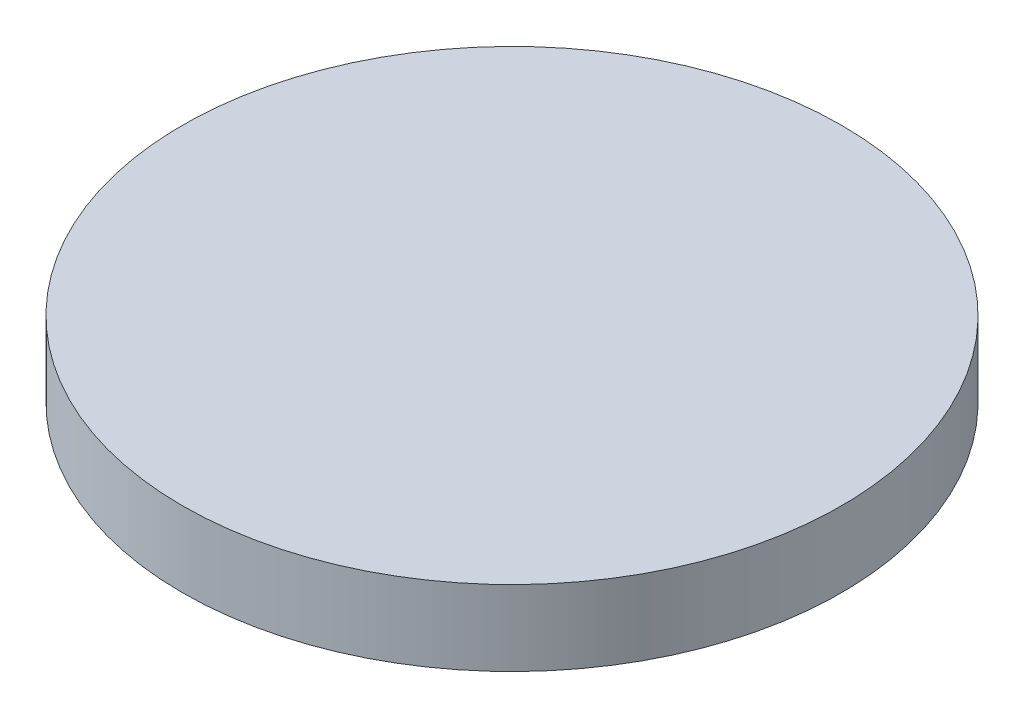
ISO-10303-21;
HEADER;
FILE_DESCRIPTION(('STEP AP214'),'2;1');
FILE_NAME('part.step','',(''),(''),'','','');
FILE_SCHEMA(('AUTOMOTIVE_DESIGN { 1 0 10303 214 1 1 1 1 }'));
ENDSEC;
DATA;
#1=APPLICATION_CONTEXT('core data for automotive mechanical design processes');
#2=APPLICATION_PROTOCOL_DEFINITION('international standard','automotive_design',2000,#1);
#3=PRODUCT_CONTEXT('',#1,'mechanical');
#4=PRODUCT('Part','Part','',(#3));
#5=PRODUCT_RELATED_PRODUCT_CATEGORY('part','',(#4));
#6=PRODUCT_DEFINITION_FORMATION('','',#4);
#7=PRODUCT_DEFINITION_CONTEXT('part definition',#1,'design');
#8=PRODUCT_DEFINITION('design','',#6,#7);
#9=PRODUCT_DEFINITION_SHAPE('','',#8);
#10=(LENGTH_UNIT() NAMED_UNIT(*) SI_UNIT(.MILLI.,.METRE.));
#11=(NAMED_UNIT(*) PLANE_ANGLE_UNIT() SI_UNIT($,.RADIAN.));
#12=(NAMED_UNIT(*) SI_UNIT($,.STERADIAN.) SOLID_ANGLE_UNIT());
#13=UNCERTAINTY_MEASURE_WITH_UNIT(LENGTH_MEASURE(1.E-05),#10,'distance_accuracy_value','');
#14=(GEOMETRIC_REPRESENTATION_CONTEXT(3) GLOBAL_UNCERTAINTY_ASSIGNED_CONTEXT((#13)) GLOBAL_UNIT_ASSIGNED_CONTEXT((#10,
#11,#12)) REPRESENTATION_CONTEXT('',''));
#15=CARTESIAN_POINT('',(0.,0.,0.));
#16=DIRECTION('',(0.,0.,1.));
#17=DIRECTION('',(1.,0.,0.));
#18=AXIS2_PLACEMENT_3D('',#15,#16,#17);
#19=CARTESIAN_POINT('',(0.,8.,0.));
#20=DIRECTION('',(0.,-1.,0.));
#21=DIRECTION('',(0.,0.,-1.));
#22=AXIS2_PLACEMENT_3D('',#19,#20,#21);
#23=CYLINDRICAL_SURFACE('',#22,35.);
#24=CARTESIAN_POINT('',(0.,8.,0.));
#25=DIRECTION('',(0.,1.,0.));
#26=DIRECTION('',(0.,0.,1.));
#27=AXIS2_PLACEMENT_3D('',#24,#25,#26);
#28=CIRCLE('',#27,35.);
#29=CARTESIAN_POINT('',(0.,8.,35.));
#30=VERTEX_POINT('',#29);
#31=EDGE_CURVE('E10',#30,#30,#28,.T.);
#32=ORIENTED_EDGE('',*,*,#31,.F.);
#33=EDGE_LOOP('',(#32));
#34=FACE_BOUND('',#33,.T.);
#35=CARTESIAN_POINT('',(0.,0.,0.));
#36=DIRECTION('',(0.,1.,0.));
#37=DIRECTION('',(0.,0.,1.));
#38=AXIS2_PLACEMENT_3D('',#35,#36,#37);
#39=CIRCLE('',#38,35.);
#40=CARTESIAN_POINT('',(0.,0.,35.));
#41=VERTEX_POINT('',#40);
#42=EDGE_CURVE('E40',#41,#41,#39,.T.);
#43=ORIENTED_EDGE('',*,*,#42,.T.);
#44=EDGE_LOOP('',(#43));
#45=FACE_BOUND('',#44,.T.);
#46=ADVANCED_FACE('F37',(#34,#45),#23,.T.);
#47=CARTESIAN_POINT('',(0.,8.,0.));
#48=DIRECTION('',(0.,1.,0.));
#49=DIRECTION('',(0.,0.,1.));
#50=AXIS2_PLACEMENT_3D('',#47,#48,#49);
#51=PLANE('',#50);
#52=ORIENTED_EDGE('',*,*,#31,.T.);
#53=EDGE_LOOP('',(#52));
#54=FACE_BOUND('',#53,.T.);
#55=ADVANCED_FACE('F54',(#54),#51,.T.);
#56=CARTESIAN_POINT('',(0.,0.,0.));
#57=DIRECTION('',(0.,1.,0.));
#58=DIRECTION('',(0.,0.,1.));
#59=AXIS2_PLACEMENT_3D('',#56,#57,#58);
#60=PLANE('',#59);
#61=ORIENTED_EDGE('',*,*,#42,.F.);
#62=EDGE_LOOP('',(#61));
#63=FACE_BOUND('',#62,.T.);
#64=ADVANCED_FACE('F52',(#63),#60,.F.);
#65=CLOSED_SHELL('',(#46,#55,#64));
#66=MANIFOLD_SOLID_BREP('B2',#65);
#67=ADVANCED_BREP_SHAPE_REPRESENTATION('',(#18,#66),#14);
#68=SHAPE_DEFINITION_REPRESENTATION(#9,#67);
ENDSEC;
END-ISO-10303-21;
